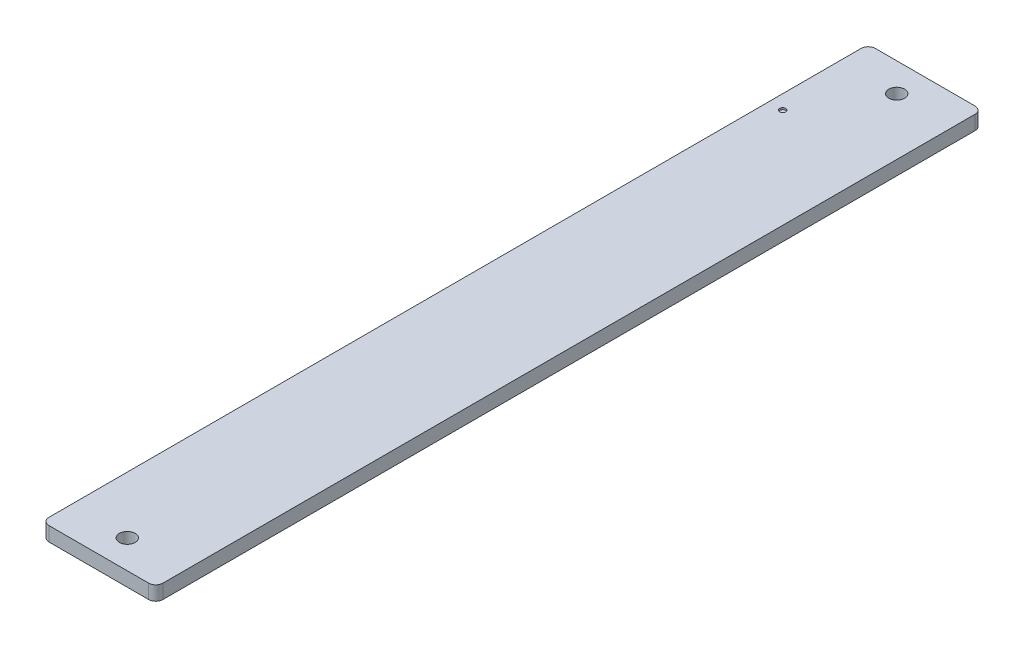
ISO-10303-21;
HEADER;
FILE_DESCRIPTION(('STEP AP214'),'2;1');
FILE_NAME('part.step','',(''),(''),'','','');
FILE_SCHEMA(('AUTOMOTIVE_DESIGN { 1 0 10303 214 1 1 1 1 }'));
ENDSEC;
DATA;
#1=APPLICATION_CONTEXT('core data for automotive mechanical design processes');
#2=APPLICATION_PROTOCOL_DEFINITION('international standard','automotive_design',2000,#1);
#3=PRODUCT_CONTEXT('',#1,'mechanical');
#4=PRODUCT('Part','Part','',(#3));
#5=PRODUCT_RELATED_PRODUCT_CATEGORY('part','',(#4));
#6=PRODUCT_DEFINITION_FORMATION('','',#4);
#7=PRODUCT_DEFINITION_CONTEXT('part definition',#1,'design');
#8=PRODUCT_DEFINITION('design','',#6,#7);
#9=PRODUCT_DEFINITION_SHAPE('','',#8);
#10=(LENGTH_UNIT() NAMED_UNIT(*) SI_UNIT(.MILLI.,.METRE.));
#11=(NAMED_UNIT(*) PLANE_ANGLE_UNIT() SI_UNIT($,.RADIAN.));
#12=(NAMED_UNIT(*) SI_UNIT($,.STERADIAN.) SOLID_ANGLE_UNIT());
#13=UNCERTAINTY_MEASURE_WITH_UNIT(LENGTH_MEASURE(1.E-05),#10,'distance_accuracy_value','');
#14=(GEOMETRIC_REPRESENTATION_CONTEXT(3) GLOBAL_UNCERTAINTY_ASSIGNED_CONTEXT((#13)) GLOBAL_UNIT_ASSIGNED_CONTEXT((#10,
#11,#12)) REPRESENTATION_CONTEXT('',''));
#15=CARTESIAN_POINT('',(0.,0.,0.));
#16=DIRECTION('',(0.,0.,1.));
#17=DIRECTION('',(1.,0.,0.));
#18=AXIS2_PLACEMENT_3D('',#15,#16,#17);
#19=CARTESIAN_POINT('',(-406.4,-3.17499999994197,-558.8));
#20=DIRECTION('',(0.,1.,0.));
#21=DIRECTION('',(-1.,0.,0.));
#22=AXIS2_PLACEMENT_3D('',#19,#20,#21);
#23=CONICAL_SURFACE('',#22,5.35813000002805,1.02974425867293);
#24=CARTESIAN_POINT('',(-406.4,-6.39448930854769,-558.799999999991));
#25=VERTEX_POINT('',#24);
#26=VERTEX_LOOP('',#25);
#27=FACE_BOUND('',#26,.T.);
#28=CARTESIAN_POINT('',(-406.4,-3.17499999999998,-558.8));
#29=DIRECTION('',(0.,1.,0.));
#30=DIRECTION('',(0.,0.,1.));
#31=AXIS2_PLACEMENT_3D('',#28,#29,#30);
#32=CIRCLE('',#31,5.35812999999996);
#33=CARTESIAN_POINT('',(-406.4,-3.17499999999998,-553.44187));
#34=VERTEX_POINT('',#33);
#35=EDGE_CURVE('E121',#34,#34,#32,.T.);
#36=ORIENTED_EDGE('',*,*,#35,.T.);
#37=EDGE_LOOP('',(#36));
#38=FACE_BOUND('',#37,.T.);
#39=ADVANCED_FACE('F16',(#27,#38),#23,.F.);
#40=CARTESIAN_POINT('',(-406.4,73.025,-558.8));
#41=DIRECTION('',(0.,1.,0.));
#42=DIRECTION('',(0.,0.,1.));
#43=AXIS2_PLACEMENT_3D('',#40,#41,#42);
#44=CYLINDRICAL_SURFACE('',#43,5.35812999999996);
#45=CARTESIAN_POINT('',(-406.4,0.,-558.8));
#46=DIRECTION('',(0.,1.,0.));
#47=DIRECTION('',(0.,0.,1.));
#48=AXIS2_PLACEMENT_3D('',#45,#46,#47);
#49=CIRCLE('',#48,5.35812999999996);
#50=CARTESIAN_POINT('',(-406.4,0.,-553.44187));
#51=VERTEX_POINT('',#50);
#52=EDGE_CURVE('E19',#51,#51,#49,.T.);
#53=ORIENTED_EDGE('',*,*,#52,.T.);
#54=EDGE_LOOP('',(#53));
#55=FACE_BOUND('',#54,.T.);
#56=ORIENTED_EDGE('',*,*,#35,.F.);
#57=EDGE_LOOP('',(#56));
#58=FACE_BOUND('',#57,.T.);
#59=ADVANCED_FACE('F152',(#55,#58),#44,.F.);
#60=CARTESIAN_POINT('',(-241.3,0.,-723.9));
#61=DIRECTION('',(0.,-1.,0.));
#62=DIRECTION('',(0.,0.,-1.));
#63=AXIS2_PLACEMENT_3D('',#60,#61,#62);
#64=PLANE('',#63);
#65=DIRECTION('',(1.,0.,0.));
#66=VECTOR('',#65,1.);
#67=CARTESIAN_POINT('',(-419.1,0.,-736.6));
#68=LINE('',#67,#66);
#69=CARTESIAN_POINT('',(-241.3,0.,-736.6));
#70=VERTEX_POINT('',#69);
#71=CARTESIAN_POINT('',(-419.1,0.,-736.6));
#72=VERTEX_POINT('',#71);
#73=EDGE_CURVE('E85',#70,#72,#68,.F.);
#74=ORIENTED_EDGE('',*,*,#73,.T.);
#75=CARTESIAN_POINT('',(-419.1,0.,-723.9));
#76=DIRECTION('',(0.,1.,0.));
#77=DIRECTION('',(0.,0.,1.));
#78=AXIS2_PLACEMENT_3D('',#75,#76,#77);
#79=CIRCLE('',#78,12.7);
#80=CARTESIAN_POINT('',(-431.8,0.,-723.9));
#81=VERTEX_POINT('',#80);
#82=EDGE_CURVE('E112',#81,#72,#79,.F.);
#83=ORIENTED_EDGE('',*,*,#82,.F.);
#84=DIRECTION('',(0.,0.,-1.));
#85=VECTOR('',#84,1.);
#86=CARTESIAN_POINT('',(-431.8,0.,723.9));
#87=LINE('',#86,#85);
#88=CARTESIAN_POINT('',(-431.8,0.,723.9));
#89=VERTEX_POINT('',#88);
#90=EDGE_CURVE('E109',#81,#89,#87,.F.);
#91=ORIENTED_EDGE('',*,*,#90,.T.);
#92=CARTESIAN_POINT('',(-419.1,0.,723.9));
#93=DIRECTION('',(0.,1.,0.));
#94=DIRECTION('',(0.,0.,1.));
#95=AXIS2_PLACEMENT_3D('',#92,#93,#94);
#96=CIRCLE('',#95,12.7);
#97=CARTESIAN_POINT('',(-419.1,0.,736.6));
#98=VERTEX_POINT('',#97);
#99=EDGE_CURVE('E117',#98,#89,#96,.F.);
#100=ORIENTED_EDGE('',*,*,#99,.F.);
#101=DIRECTION('',(-1.,0.,0.));
#102=VECTOR('',#101,1.);
#103=CARTESIAN_POINT('',(-419.1,0.,736.6));
#104=LINE('',#103,#102);
#105=CARTESIAN_POINT('',(-241.3,0.,736.6));
#106=VERTEX_POINT('',#105);
#107=EDGE_CURVE('E114',#98,#106,#104,.F.);
#108=ORIENTED_EDGE('',*,*,#107,.T.);
#109=CARTESIAN_POINT('',(-241.3,0.,723.9));
#110=DIRECTION('',(0.,1.,0.));
#111=DIRECTION('',(0.,0.,1.));
#112=AXIS2_PLACEMENT_3D('',#109,#110,#111);
#113=CIRCLE('',#112,12.7);
#114=CARTESIAN_POINT('',(-228.6,0.,723.9));
#115=VERTEX_POINT('',#114);
#116=EDGE_CURVE('E120',#115,#106,#113,.F.);
#117=ORIENTED_EDGE('',*,*,#116,.F.);
#118=DIRECTION('',(0.,0.,1.));
#119=VECTOR('',#118,1.);
#120=CARTESIAN_POINT('',(-228.6,0.,723.9));
#121=LINE('',#120,#119);
#122=CARTESIAN_POINT('',(-228.6,0.,-723.9));
#123=VERTEX_POINT('',#122);
#124=EDGE_CURVE('E87',#115,#123,#121,.F.);
#125=ORIENTED_EDGE('',*,*,#124,.T.);
#126=CARTESIAN_POINT('',(-241.3,0.,-723.9));
#127=DIRECTION('',(0.,1.,0.));
#128=DIRECTION('',(0.,0.,1.));
#129=AXIS2_PLACEMENT_3D('',#126,#127,#128);
#130=CIRCLE('',#129,12.7);
#131=EDGE_CURVE('E80',#70,#123,#130,.F.);
#132=ORIENTED_EDGE('',*,*,#131,.F.);
#133=EDGE_LOOP('',(#74,#83,#91,#100,#108,#117,#125,#132));
#134=FACE_BOUND('',#133,.T.);
#135=ORIENTED_EDGE('',*,*,#52,.F.);
#136=EDGE_LOOP('',(#135));
#137=FACE_BOUND('',#136,.T.);
#138=CARTESIAN_POINT('',(-330.199999999999,0.,-685.8));
#139=DIRECTION('',(0.,-1.,0.));
#140=DIRECTION('',(0.,0.,-1.));
#141=AXIS2_PLACEMENT_3D('',#138,#139,#140);
#142=CIRCLE('',#141,14.0893799999999);
#143=CARTESIAN_POINT('',(-330.199999999999,0.,-699.88938));
#144=VERTEX_POINT('',#143);
#145=EDGE_CURVE('E91',#144,#144,#142,.T.);
#146=ORIENTED_EDGE('',*,*,#145,.T.);
#147=EDGE_LOOP('',(#146));
#148=FACE_BOUND('',#147,.T.);
#149=CARTESIAN_POINT('',(-330.2,0.,685.8));
#150=DIRECTION('',(0.,-1.,0.));
#151=DIRECTION('',(0.,0.,-1.));
#152=AXIS2_PLACEMENT_3D('',#149,#150,#151);
#153=CIRCLE('',#152,14.0893799999999);
#154=CARTESIAN_POINT('',(-330.2,0.,671.71062));
#155=VERTEX_POINT('',#154);
#156=EDGE_CURVE('E145',#155,#155,#153,.T.);
#157=ORIENTED_EDGE('',*,*,#156,.T.);
#158=EDGE_LOOP('',(#157));
#159=FACE_BOUND('',#158,.T.);
#160=ADVANCED_FACE('F82',(#134,#137,#148,#159),#64,.F.);
#161=CARTESIAN_POINT('',(-330.2,-25.4,685.8));
#162=DIRECTION('',(0.,-1.,0.));
#163=DIRECTION('',(0.,0.,-1.));
#164=AXIS2_PLACEMENT_3D('',#161,#162,#163);
#165=CYLINDRICAL_SURFACE('',#164,14.0893799999999);
#166=CARTESIAN_POINT('',(-330.2,-25.4,685.8));
#167=DIRECTION('',(0.,-1.,0.));
#168=DIRECTION('',(0.,0.,-1.));
#169=AXIS2_PLACEMENT_3D('',#166,#167,#168);
#170=CIRCLE('',#169,14.0893799999999);
#171=CARTESIAN_POINT('',(-330.2,-25.4,671.71062));
#172=VERTEX_POINT('',#171);
#173=EDGE_CURVE('E101',#172,#172,#170,.F.);
#174=ORIENTED_EDGE('',*,*,#173,.F.);
#175=EDGE_LOOP('',(#174));
#176=FACE_BOUND('',#175,.T.);
#177=ORIENTED_EDGE('',*,*,#156,.F.);
#178=EDGE_LOOP('',(#177));
#179=FACE_BOUND('',#178,.T.);
#180=ADVANCED_FACE('F156',(#176,#179),#165,.F.);
#181=CARTESIAN_POINT('',(-330.199999999999,-25.4,-685.8));
#182=DIRECTION('',(0.,-1.,0.));
#183=DIRECTION('',(0.,0.,-1.));
#184=AXIS2_PLACEMENT_3D('',#181,#182,#183);
#185=CYLINDRICAL_SURFACE('',#184,14.0893799999999);
#186=CARTESIAN_POINT('',(-330.199999999999,-25.4,-685.8));
#187=DIRECTION('',(0.,-1.,0.));
#188=DIRECTION('',(0.,0.,-1.));
#189=AXIS2_PLACEMENT_3D('',#186,#187,#188);
#190=CIRCLE('',#189,14.0893799999999);
#191=CARTESIAN_POINT('',(-330.199999999999,-25.4,-699.88938));
#192=VERTEX_POINT('',#191);
#193=EDGE_CURVE('E104',#192,#192,#190,.F.);
#194=ORIENTED_EDGE('',*,*,#193,.F.);
#195=EDGE_LOOP('',(#194));
#196=FACE_BOUND('',#195,.T.);
#197=ORIENTED_EDGE('',*,*,#145,.F.);
#198=EDGE_LOOP('',(#197));
#199=FACE_BOUND('',#198,.T.);
#200=ADVANCED_FACE('F160',(#196,#199),#185,.F.);
#201=CARTESIAN_POINT('',(-241.3,-25.4,-723.9));
#202=DIRECTION('',(0.,1.,0.));
#203=DIRECTION('',(0.,0.,1.));
#204=AXIS2_PLACEMENT_3D('',#201,#202,#203);
#205=CYLINDRICAL_SURFACE('',#204,12.7);
#206=CARTESIAN_POINT('',(-241.3,-25.4,-723.9));
#207=DIRECTION('',(0.,1.,0.));
#208=DIRECTION('',(0.,0.,1.));
#209=AXIS2_PLACEMENT_3D('',#206,#207,#208);
#210=CIRCLE('',#209,12.7);
#211=CARTESIAN_POINT('',(-241.3,-25.4,-736.6));
#212=VERTEX_POINT('',#211);
#213=CARTESIAN_POINT('',(-228.6,-25.4,-723.9));
#214=VERTEX_POINT('',#213);
#215=EDGE_CURVE('E97',#212,#214,#210,.F.);
#216=ORIENTED_EDGE('',*,*,#215,.F.);
#217=DIRECTION('',(0.,1.,0.));
#218=VECTOR('',#217,1.);
#219=CARTESIAN_POINT('',(-241.3,-25.4,-736.6));
#220=LINE('',#219,#218);
#221=EDGE_CURVE('E94',#212,#70,#220,.T.);
#222=ORIENTED_EDGE('',*,*,#221,.T.);
#223=ORIENTED_EDGE('',*,*,#131,.T.);
#224=DIRECTION('',(0.,1.,0.));
#225=VECTOR('',#224,1.);
#226=CARTESIAN_POINT('',(-228.6,-25.4,-723.9));
#227=LINE('',#226,#225);
#228=EDGE_CURVE('E90',#123,#214,#227,.F.);
#229=ORIENTED_EDGE('',*,*,#228,.T.);
#230=EDGE_LOOP('',(#216,#222,#223,#229));
#231=FACE_BOUND('',#230,.T.);
#232=ADVANCED_FACE('F95',(#231),#205,.T.);
#233=CARTESIAN_POINT('',(-228.6,-25.4,723.9));
#234=DIRECTION('',(-1.,0.,0.));
#235=DIRECTION('',(0.,0.,1.));
#236=AXIS2_PLACEMENT_3D('',#233,#234,#235);
#237=PLANE('',#236);
#238=DIRECTION('',(0.,1.,0.));
#239=VECTOR('',#238,1.);
#240=CARTESIAN_POINT('',(-228.6,-25.4,723.9));
#241=LINE('',#240,#239);
#242=CARTESIAN_POINT('',(-228.6,-25.4,723.9));
#243=VERTEX_POINT('',#242);
#244=EDGE_CURVE('E142',#243,#115,#241,.T.);
#245=ORIENTED_EDGE('',*,*,#244,.F.);
#246=DIRECTION('',(0.,0.,-1.));
#247=VECTOR('',#246,1.);
#248=CARTESIAN_POINT('',(-228.6,-25.4,-723.9));
#249=LINE('',#248,#247);
#250=EDGE_CURVE('E134',#214,#243,#249,.F.);
#251=ORIENTED_EDGE('',*,*,#250,.F.);
#252=ORIENTED_EDGE('',*,*,#228,.F.);
#253=ORIENTED_EDGE('',*,*,#124,.F.);
#254=EDGE_LOOP('',(#245,#251,#252,#253));
#255=FACE_BOUND('',#254,.T.);
#256=ADVANCED_FACE('F169',(#255),#237,.F.);
#257=CARTESIAN_POINT('',(-241.3,-25.4,723.9));
#258=DIRECTION('',(0.,1.,0.));
#259=DIRECTION('',(0.,0.,1.));
#260=AXIS2_PLACEMENT_3D('',#257,#258,#259);
#261=CYLINDRICAL_SURFACE('',#260,12.7);
#262=CARTESIAN_POINT('',(-241.3,-25.4,723.9));
#263=DIRECTION('',(0.,1.,0.));
#264=DIRECTION('',(0.,0.,1.));
#265=AXIS2_PLACEMENT_3D('',#262,#263,#264);
#266=CIRCLE('',#265,12.7);
#267=CARTESIAN_POINT('',(-241.3,-25.4,736.6));
#268=VERTEX_POINT('',#267);
#269=EDGE_CURVE('E131',#243,#268,#266,.F.);
#270=ORIENTED_EDGE('',*,*,#269,.F.);
#271=ORIENTED_EDGE('',*,*,#244,.T.);
#272=ORIENTED_EDGE('',*,*,#116,.T.);
#273=DIRECTION('',(0.,1.,0.));
#274=VECTOR('',#273,1.);
#275=CARTESIAN_POINT('',(-241.3,-25.4,736.6));
#276=LINE('',#275,#274);
#277=EDGE_CURVE('E118',#106,#268,#276,.F.);
#278=ORIENTED_EDGE('',*,*,#277,.T.);
#279=EDGE_LOOP('',(#270,#271,#272,#278));
#280=FACE_BOUND('',#279,.T.);
#281=ADVANCED_FACE('F198',(#280),#261,.T.);
#282=CARTESIAN_POINT('',(-419.1,-25.4,736.6));
#283=DIRECTION('',(0.,0.,-1.));
#284=DIRECTION('',(-1.,0.,0.));
#285=AXIS2_PLACEMENT_3D('',#282,#283,#284);
#286=PLANE('',#285);
#287=DIRECTION('',(0.,1.,0.));
#288=VECTOR('',#287,1.);
#289=CARTESIAN_POINT('',(-419.1,-25.4,736.6));
#290=LINE('',#289,#288);
#291=CARTESIAN_POINT('',(-419.1,-25.4,736.6));
#292=VERTEX_POINT('',#291);
#293=EDGE_CURVE('E141',#292,#98,#290,.T.);
#294=ORIENTED_EDGE('',*,*,#293,.F.);
#295=DIRECTION('',(1.,0.,0.));
#296=VECTOR('',#295,1.);
#297=CARTESIAN_POINT('',(-241.3,-25.4,736.6));
#298=LINE('',#297,#296);
#299=EDGE_CURVE('E130',#268,#292,#298,.F.);
#300=ORIENTED_EDGE('',*,*,#299,.F.);
#301=ORIENTED_EDGE('',*,*,#277,.F.);
#302=ORIENTED_EDGE('',*,*,#107,.F.);
#303=EDGE_LOOP('',(#294,#300,#301,#302));
#304=FACE_BOUND('',#303,.T.);
#305=ADVANCED_FACE('F194',(#304),#286,.F.);
#306=CARTESIAN_POINT('',(-419.1,-25.4,723.9));
#307=DIRECTION('',(0.,1.,0.));
#308=DIRECTION('',(0.,0.,1.));
#309=AXIS2_PLACEMENT_3D('',#306,#307,#308);
#310=CYLINDRICAL_SURFACE('',#309,12.7);
#311=CARTESIAN_POINT('',(-419.1,-25.4,723.9));
#312=DIRECTION('',(0.,1.,0.));
#313=DIRECTION('',(0.,0.,1.));
#314=AXIS2_PLACEMENT_3D('',#311,#312,#313);
#315=CIRCLE('',#314,12.7);
#316=CARTESIAN_POINT('',(-431.8,-25.4,723.9));
#317=VERTEX_POINT('',#316);
#318=EDGE_CURVE('E127',#292,#317,#315,.F.);
#319=ORIENTED_EDGE('',*,*,#318,.F.);
#320=ORIENTED_EDGE('',*,*,#293,.T.);
#321=ORIENTED_EDGE('',*,*,#99,.T.);
#322=DIRECTION('',(0.,1.,0.));
#323=VECTOR('',#322,1.);
#324=CARTESIAN_POINT('',(-431.8,-25.4,723.9));
#325=LINE('',#324,#323);
#326=EDGE_CURVE('E113',#89,#317,#325,.F.);
#327=ORIENTED_EDGE('',*,*,#326,.T.);
#328=EDGE_LOOP('',(#319,#320,#321,#327));
#329=FACE_BOUND('',#328,.T.);
#330=ADVANCED_FACE('F190',(#329),#310,.T.);
#331=CARTESIAN_POINT('',(-431.8,-25.4,723.9));
#332=DIRECTION('',(1.,0.,0.));
#333=DIRECTION('',(0.,0.,-1.));
#334=AXIS2_PLACEMENT_3D('',#331,#332,#333);
#335=PLANE('',#334);
#336=DIRECTION('',(0.,1.,0.));
#337=VECTOR('',#336,1.);
#338=CARTESIAN_POINT('',(-431.8,-25.4,-723.9));
#339=LINE('',#338,#337);
#340=CARTESIAN_POINT('',(-431.8,-25.4,-723.9));
#341=VERTEX_POINT('',#340);
#342=EDGE_CURVE('E139',#341,#81,#339,.T.);
#343=ORIENTED_EDGE('',*,*,#342,.F.);
#344=DIRECTION('',(0.,0.,-1.));
#345=VECTOR('',#344,1.);
#346=CARTESIAN_POINT('',(-431.8,-25.4,-723.9));
#347=LINE('',#346,#345);
#348=EDGE_CURVE('E126',#317,#341,#347,.T.);
#349=ORIENTED_EDGE('',*,*,#348,.F.);
#350=ORIENTED_EDGE('',*,*,#326,.F.);
#351=ORIENTED_EDGE('',*,*,#90,.F.);
#352=EDGE_LOOP('',(#343,#349,#350,#351));
#353=FACE_BOUND('',#352,.T.);
#354=ADVANCED_FACE('F187',(#353),#335,.F.);
#355=CARTESIAN_POINT('',(-419.1,-25.4,-723.9));
#356=DIRECTION('',(0.,1.,0.));
#357=DIRECTION('',(0.,0.,1.));
#358=AXIS2_PLACEMENT_3D('',#355,#356,#357);
#359=CYLINDRICAL_SURFACE('',#358,12.7);
#360=CARTESIAN_POINT('',(-419.1,-25.4,-723.9));
#361=DIRECTION('',(0.,1.,0.));
#362=DIRECTION('',(0.,0.,1.));
#363=AXIS2_PLACEMENT_3D('',#360,#361,#362);
#364=CIRCLE('',#363,12.7);
#365=CARTESIAN_POINT('',(-419.1,-25.4,-736.6));
#366=VERTEX_POINT('',#365);
#367=EDGE_CURVE('E25',#341,#366,#364,.F.);
#368=ORIENTED_EDGE('',*,*,#367,.F.);
#369=ORIENTED_EDGE('',*,*,#342,.T.);
#370=ORIENTED_EDGE('',*,*,#82,.T.);
#371=DIRECTION('',(0.,1.,0.));
#372=VECTOR('',#371,1.);
#373=CARTESIAN_POINT('',(-419.1,-25.4,-736.6));
#374=LINE('',#373,#372);
#375=EDGE_CURVE('E34',#72,#366,#374,.F.);
#376=ORIENTED_EDGE('',*,*,#375,.T.);
#377=EDGE_LOOP('',(#368,#369,#370,#376));
#378=FACE_BOUND('',#377,.T.);
#379=ADVANCED_FACE('F181',(#378),#359,.T.);
#380=CARTESIAN_POINT('',(-419.1,-25.4,-736.6));
#381=DIRECTION('',(0.,0.,1.));
#382=DIRECTION('',(1.,0.,0.));
#383=AXIS2_PLACEMENT_3D('',#380,#381,#382);
#384=PLANE('',#383);
#385=ORIENTED_EDGE('',*,*,#221,.F.);
#386=DIRECTION('',(1.,0.,0.));
#387=VECTOR('',#386,1.);
#388=CARTESIAN_POINT('',(-241.3,-25.4,-736.6));
#389=LINE('',#388,#387);
#390=EDGE_CURVE('E11',#366,#212,#389,.T.);
#391=ORIENTED_EDGE('',*,*,#390,.F.);
#392=ORIENTED_EDGE('',*,*,#375,.F.);
#393=ORIENTED_EDGE('',*,*,#73,.F.);
#394=EDGE_LOOP('',(#385,#391,#392,#393));
#395=FACE_BOUND('',#394,.T.);
#396=ADVANCED_FACE('F100',(#395),#384,.F.);
#397=CARTESIAN_POINT('',(-241.3,-25.4,-723.9));
#398=DIRECTION('',(0.,-1.,0.));
#399=DIRECTION('',(0.,0.,-1.));
#400=AXIS2_PLACEMENT_3D('',#397,#398,#399);
#401=PLANE('',#400);
#402=ORIENTED_EDGE('',*,*,#367,.T.);
#403=ORIENTED_EDGE('',*,*,#390,.T.);
#404=ORIENTED_EDGE('',*,*,#215,.T.);
#405=ORIENTED_EDGE('',*,*,#250,.T.);
#406=ORIENTED_EDGE('',*,*,#269,.T.);
#407=ORIENTED_EDGE('',*,*,#299,.T.);
#408=ORIENTED_EDGE('',*,*,#318,.T.);
#409=ORIENTED_EDGE('',*,*,#348,.T.);
#410=EDGE_LOOP('',(#402,#403,#404,#405,#406,#407,#408,#409));
#411=FACE_BOUND('',#410,.T.);
#412=ORIENTED_EDGE('',*,*,#193,.T.);
#413=EDGE_LOOP('',(#412));
#414=FACE_BOUND('',#413,.T.);
#415=ORIENTED_EDGE('',*,*,#173,.T.);
#416=EDGE_LOOP('',(#415));
#417=FACE_BOUND('',#416,.T.);
#418=ADVANCED_FACE('F174',(#411,#414,#417),#401,.T.);
#419=CLOSED_SHELL('',(#39,#59,#160,#180,#200,#232,#256,#281,#305,#330,#354,#379,#396,#418));
#420=MANIFOLD_SOLID_BREP('B1',#419);
#421=ADVANCED_BREP_SHAPE_REPRESENTATION('',(#18,#420),#14);
#422=SHAPE_DEFINITION_REPRESENTATION(#9,#421);
ENDSEC;
END-ISO-10303-21;
